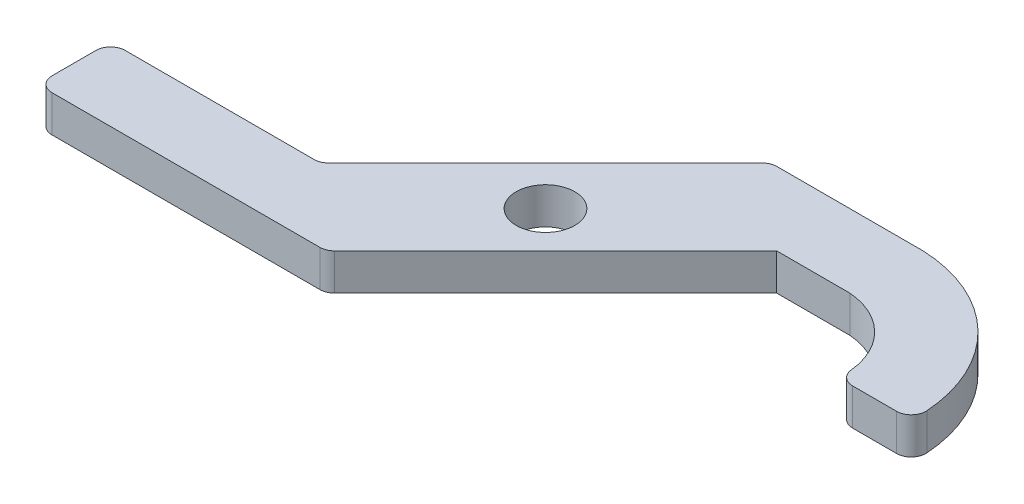
ISO-10303-21;
HEADER;
FILE_DESCRIPTION(('STEP AP214'),'2;1');
FILE_NAME('part.step','',(''),(''),'','','');
FILE_SCHEMA(('AUTOMOTIVE_DESIGN { 1 0 10303 214 1 1 1 1 }'));
ENDSEC;
DATA;
#1=APPLICATION_CONTEXT('core data for automotive mechanical design processes');
#2=APPLICATION_PROTOCOL_DEFINITION('international standard','automotive_design',2000,#1);
#3=PRODUCT_CONTEXT('',#1,'mechanical');
#4=PRODUCT('Part','Part','',(#3));
#5=PRODUCT_RELATED_PRODUCT_CATEGORY('part','',(#4));
#6=PRODUCT_DEFINITION_FORMATION('','',#4);
#7=PRODUCT_DEFINITION_CONTEXT('part definition',#1,'design');
#8=PRODUCT_DEFINITION('design','',#6,#7);
#9=PRODUCT_DEFINITION_SHAPE('','',#8);
#10=(LENGTH_UNIT() NAMED_UNIT(*) SI_UNIT(.MILLI.,.METRE.));
#11=(NAMED_UNIT(*) PLANE_ANGLE_UNIT() SI_UNIT($,.RADIAN.));
#12=(NAMED_UNIT(*) SI_UNIT($,.STERADIAN.) SOLID_ANGLE_UNIT());
#13=UNCERTAINTY_MEASURE_WITH_UNIT(LENGTH_MEASURE(1.E-05),#10,'distance_accuracy_value','');
#14=(GEOMETRIC_REPRESENTATION_CONTEXT(3) GLOBAL_UNCERTAINTY_ASSIGNED_CONTEXT((#13)) GLOBAL_UNIT_ASSIGNED_CONTEXT((#10,
#11,#12)) REPRESENTATION_CONTEXT('',''));
#15=CARTESIAN_POINT('',(0.,0.,0.));
#16=DIRECTION('',(0.,0.,1.));
#17=DIRECTION('',(1.,0.,0.));
#18=AXIS2_PLACEMENT_3D('',#15,#16,#17);
#19=CARTESIAN_POINT('',(-27.4559916240375,6.35,-14.569992415447));
#20=DIRECTION('',(0.,-1.,0.));
#21=DIRECTION('',(0.,0.,-1.));
#22=AXIS2_PLACEMENT_3D('',#19,#20,#21);
#23=PLANE('',#22);
#24=CARTESIAN_POINT('',(-27.4559916240375,6.35,-14.569992415447));
#25=DIRECTION('',(0.,-1.,0.));
#26=DIRECTION('',(0.,0.,-1.));
#27=AXIS2_PLACEMENT_3D('',#24,#25,#26);
#28=CIRCLE('',#27,2.54);
#29=CARTESIAN_POINT('',(-25.6599403998237,6.35,-12.7739411912331));
#30=VERTEX_POINT('',#29);
#31=CARTESIAN_POINT('',(-27.4559916240375,6.35,-12.029992415447));
#32=VERTEX_POINT('',#31);
#33=EDGE_CURVE('E316',#30,#32,#28,.T.);
#34=ORIENTED_EDGE('',*,*,#33,.T.);
#35=DIRECTION('',(-1.,0.,0.));
#36=VECTOR('',#35,1.);
#37=CARTESIAN_POINT('',(-27.4559916240375,6.35,-12.029992415447));
#38=LINE('',#37,#36);
#39=CARTESIAN_POINT('',(-60.2306041945383,6.35,-12.029992415447));
#40=VERTEX_POINT('',#39);
#41=EDGE_CURVE('E182',#32,#40,#38,.T.);
#42=ORIENTED_EDGE('',*,*,#41,.T.);
#43=CARTESIAN_POINT('',(-60.2306041945383,6.35,-9.48999241544698));
#44=DIRECTION('',(0.,1.,0.));
#45=DIRECTION('',(0.,0.,1.));
#46=AXIS2_PLACEMENT_3D('',#43,#44,#45);
#47=CIRCLE('',#46,2.54);
#48=CARTESIAN_POINT('',(-62.7706041945383,6.35,-9.48999241544698));
#49=VERTEX_POINT('',#48);
#50=EDGE_CURVE('E365',#40,#49,#47,.T.);
#51=ORIENTED_EDGE('',*,*,#50,.T.);
#52=DIRECTION('',(0.,0.,-1.));
#53=VECTOR('',#52,1.);
#54=CARTESIAN_POINT('',(-62.7706041945383,6.35,-1.86999241544697));
#55=LINE('',#54,#53);
#56=CARTESIAN_POINT('',(-62.7706041945383,6.35,-1.86999241544697));
#57=VERTEX_POINT('',#56);
#58=EDGE_CURVE('E375',#57,#49,#55,.T.);
#59=ORIENTED_EDGE('',*,*,#58,.F.);
#60=CARTESIAN_POINT('',(-60.2306041945383,6.35,-1.86999241544697));
#61=DIRECTION('',(0.,-1.,0.));
#62=DIRECTION('',(0.,0.,-1.));
#63=AXIS2_PLACEMENT_3D('',#60,#61,#62);
#64=CIRCLE('',#63,2.54);
#65=CARTESIAN_POINT('',(-60.2306041945383,6.35,0.670007584553028));
#66=VERTEX_POINT('',#65);
#67=EDGE_CURVE('E379',#66,#57,#64,.T.);
#68=ORIENTED_EDGE('',*,*,#67,.F.);
#69=DIRECTION('',(-1.,0.,0.));
#70=VECTOR('',#69,1.);
#71=CARTESIAN_POINT('',(-13.7521024484274,6.35,0.670007584553022));
#72=LINE('',#71,#70);
#73=CARTESIAN_POINT('',(-13.7521024484274,6.35,0.670007584553021));
#74=VERTEX_POINT('',#73);
#75=EDGE_CURVE('E383',#74,#66,#72,.T.);
#76=ORIENTED_EDGE('',*,*,#75,.F.);
#77=CARTESIAN_POINT('',(-13.7521024484274,6.35,-1.86999241544698));
#78=DIRECTION('',(0.,-1.,0.));
#79=DIRECTION('',(0.,0.,-1.));
#80=AXIS2_PLACEMENT_3D('',#77,#78,#79);
#81=CIRCLE('',#80,2.54);
#82=CARTESIAN_POINT('',(-11.9560512242136,6.35,-0.0739411912331479));
#83=VERTEX_POINT('',#82);
#84=EDGE_CURVE('E391',#83,#74,#81,.T.);
#85=ORIENTED_EDGE('',*,*,#84,.F.);
#86=DIRECTION('',(0.707106781186548,0.,-0.707106781186548));
#87=VECTOR('',#86,1.);
#88=CARTESIAN_POINT('',(-11.9560512242136,6.35,-0.0739411912331479));
#89=LINE('',#88,#87);
#90=CARTESIAN_POINT('',(26.4038891756102,6.35,-38.4338815910569));
#91=VERTEX_POINT('',#90);
#92=EDGE_CURVE('E395',#83,#91,#89,.T.);
#93=ORIENTED_EDGE('',*,*,#92,.T.);
#94=DIRECTION('',(1.,0.,0.));
#95=VECTOR('',#94,1.);
#96=CARTESIAN_POINT('',(26.4038891756102,6.35,-38.4338815910569));
#97=LINE('',#96,#95);
#98=CARTESIAN_POINT('',(39.1038891756094,6.35,-38.4338815910569));
#99=VERTEX_POINT('',#98);
#100=EDGE_CURVE('E398',#91,#99,#97,.T.);
#101=ORIENTED_EDGE('',*,*,#100,.T.);
#102=CARTESIAN_POINT('',(38.1,6.35,-25.7338815910569));
#103=DIRECTION('',(0.,-1.,0.));
#104=DIRECTION('',(0.,0.,-1.));
#105=AXIS2_PLACEMENT_3D('',#102,#103,#104);
#106=CIRCLE('',#105,12.7396151227934);
#107=CARTESIAN_POINT('',(50.7750722767063,6.35,-27.0146377181857));
#108=VERTEX_POINT('',#107);
#109=EDGE_CURVE('E401',#99,#108,#106,.T.);
#110=ORIENTED_EDGE('',*,*,#109,.T.);
#111=CARTESIAN_POINT('',(53.3022038479915,6.35,-27.269992415447));
#112=DIRECTION('',(0.,-1.,0.));
#113=DIRECTION('',(0.,0.,-1.));
#114=AXIS2_PLACEMENT_3D('',#111,#112,#113);
#115=CIRCLE('',#114,2.54);
#116=CARTESIAN_POINT('',(53.3022038479915,6.35,-24.729992415447));
#117=VERTEX_POINT('',#116);
#118=EDGE_CURVE('E404',#117,#108,#115,.T.);
#119=ORIENTED_EDGE('',*,*,#118,.F.);
#120=DIRECTION('',(1.,0.,0.));
#121=VECTOR('',#120,1.);
#122=CARTESIAN_POINT('',(53.3022038479915,6.35,-24.729992415447));
#123=LINE('',#122,#121);
#124=CARTESIAN_POINT('',(60.9282066091519,6.35,-24.729992415447));
#125=VERTEX_POINT('',#124);
#126=EDGE_CURVE('E408',#117,#125,#123,.T.);
#127=ORIENTED_EDGE('',*,*,#126,.T.);
#128=CARTESIAN_POINT('',(60.9282066091519,6.35,-27.269992415447));
#129=DIRECTION('',(0.,1.,0.));
#130=DIRECTION('',(0.,0.,1.));
#131=AXIS2_PLACEMENT_3D('',#128,#129,#130);
#132=CIRCLE('',#131,2.54);
#133=CARTESIAN_POINT('',(63.4624755692073,6.35,-27.4405234627653));
#134=VERTEX_POINT('',#133);
#135=EDGE_CURVE('E411',#125,#134,#132,.T.);
#136=ORIENTED_EDGE('',*,*,#135,.T.);
#137=CARTESIAN_POINT('',(38.0999999999999,6.35,-25.7338815910569));
#138=DIRECTION('',(0.,-1.,0.));
#139=DIRECTION('',(0.,0.,-1.));
#140=AXIS2_PLACEMENT_3D('',#137,#138,#139);
#141=CIRCLE('',#140,25.4198307129869);
#142=CARTESIAN_POINT('',(39.1038891756115,6.35,-51.1338815910569));
#143=VERTEX_POINT('',#142);
#144=EDGE_CURVE('E244',#143,#134,#141,.T.);
#145=ORIENTED_EDGE('',*,*,#144,.F.);
#146=DIRECTION('',(1.,0.,0.));
#147=VECTOR('',#146,1.);
#148=CARTESIAN_POINT('',(13.7521024484277,6.35,-51.1338815910569));
#149=LINE('',#148,#147);
#150=CARTESIAN_POINT('',(13.7521024484277,6.35,-51.1338815910569));
#151=VERTEX_POINT('',#150);
#152=EDGE_CURVE('E228',#151,#143,#149,.T.);
#153=ORIENTED_EDGE('',*,*,#152,.F.);
#154=CARTESIAN_POINT('',(13.7521024484277,6.35,-48.5938815910569));
#155=DIRECTION('',(0.,-1.,0.));
#156=DIRECTION('',(0.,0.,-1.));
#157=AXIS2_PLACEMENT_3D('',#154,#155,#156);
#158=CIRCLE('',#157,2.54);
#159=CARTESIAN_POINT('',(11.9560512242139,6.35,-50.3899328152707));
#160=VERTEX_POINT('',#159);
#161=EDGE_CURVE('E242',#160,#151,#158,.T.);
#162=ORIENTED_EDGE('',*,*,#161,.F.);
#163=DIRECTION('',(0.707106781186548,0.,-0.707106781186548));
#164=VECTOR('',#163,1.);
#165=CARTESIAN_POINT('',(-25.6599403998237,6.35,-12.7739411912331));
#166=LINE('',#165,#164);
#167=EDGE_CURVE('E249',#30,#160,#166,.T.);
#168=ORIENTED_EDGE('',*,*,#167,.F.);
#169=EDGE_LOOP('',(#34,#42,#51,#59,#68,#76,#85,#93,#101,#110,#119,#127,#136,#145,#153,#162,#168));
#170=FACE_BOUND('',#169,.T.);
#171=CARTESIAN_POINT('',(0.,6.35,-24.729992415447));
#172=DIRECTION('',(0.,1.,0.));
#173=DIRECTION('',(0.,0.,1.));
#174=AXIS2_PLACEMENT_3D('',#171,#172,#173);
#175=CIRCLE('',#174,5.08);
#176=CARTESIAN_POINT('',(0.,6.35,-19.649992415447));
#177=VERTEX_POINT('',#176);
#178=EDGE_CURVE('E259',#177,#177,#175,.T.);
#179=ORIENTED_EDGE('',*,*,#178,.F.);
#180=EDGE_LOOP('',(#179));
#181=FACE_BOUND('',#180,.T.);
#182=ADVANCED_FACE('F99',(#170,#181),#23,.F.);
#183=CARTESIAN_POINT('',(-27.4559916240375,0.,-14.569992415447));
#184=DIRECTION('',(0.,-1.,0.));
#185=DIRECTION('',(0.,0.,-1.));
#186=AXIS2_PLACEMENT_3D('',#183,#184,#185);
#187=PLANE('',#186);
#188=CARTESIAN_POINT('',(-27.4559916240375,0.,-14.569992415447));
#189=DIRECTION('',(0.,-1.,0.));
#190=DIRECTION('',(0.,0.,-1.));
#191=AXIS2_PLACEMENT_3D('',#188,#189,#190);
#192=CIRCLE('',#191,2.54);
#193=CARTESIAN_POINT('',(-25.6599403998237,0.,-12.7739411912331));
#194=VERTEX_POINT('',#193);
#195=CARTESIAN_POINT('',(-27.4559916240375,0.,-12.029992415447));
#196=VERTEX_POINT('',#195);
#197=EDGE_CURVE('E255',#194,#196,#192,.T.);
#198=ORIENTED_EDGE('',*,*,#197,.F.);
#199=DIRECTION('',(0.707106781186548,0.,-0.707106781186548));
#200=VECTOR('',#199,1.);
#201=CARTESIAN_POINT('',(-25.6599403998237,0.,-12.7739411912331));
#202=LINE('',#201,#200);
#203=CARTESIAN_POINT('',(11.9560512242139,0.,-50.3899328152707));
#204=VERTEX_POINT('',#203);
#205=EDGE_CURVE('E312',#194,#204,#202,.T.);
#206=ORIENTED_EDGE('',*,*,#205,.T.);
#207=CARTESIAN_POINT('',(13.7521024484277,0.,-48.5938815910569));
#208=DIRECTION('',(0.,-1.,0.));
#209=DIRECTION('',(0.,0.,-1.));
#210=AXIS2_PLACEMENT_3D('',#207,#208,#209);
#211=CIRCLE('',#210,2.54);
#212=CARTESIAN_POINT('',(13.7521024484277,0.,-51.1338815910569));
#213=VERTEX_POINT('',#212);
#214=EDGE_CURVE('E309',#204,#213,#211,.T.);
#215=ORIENTED_EDGE('',*,*,#214,.T.);
#216=DIRECTION('',(1.,0.,0.));
#217=VECTOR('',#216,1.);
#218=CARTESIAN_POINT('',(13.7521024484277,0.,-51.1338815910569));
#219=LINE('',#218,#217);
#220=CARTESIAN_POINT('',(39.1038891756115,0.,-51.1338815910569));
#221=VERTEX_POINT('',#220);
#222=EDGE_CURVE('E230',#213,#221,#219,.T.);
#223=ORIENTED_EDGE('',*,*,#222,.T.);
#224=CARTESIAN_POINT('',(38.0999999999999,0.,-25.7338815910569));
#225=DIRECTION('',(0.,-1.,0.));
#226=DIRECTION('',(0.,0.,-1.));
#227=AXIS2_PLACEMENT_3D('',#224,#225,#226);
#228=CIRCLE('',#227,25.4198307129869);
#229=CARTESIAN_POINT('',(63.4624755692073,0.,-27.4405234627653));
#230=VERTEX_POINT('',#229);
#231=EDGE_CURVE('E303',#221,#230,#228,.T.);
#232=ORIENTED_EDGE('',*,*,#231,.T.);
#233=CARTESIAN_POINT('',(60.9282066091519,0.,-27.269992415447));
#234=DIRECTION('',(0.,1.,0.));
#235=DIRECTION('',(0.,0.,1.));
#236=AXIS2_PLACEMENT_3D('',#233,#234,#235);
#237=CIRCLE('',#236,2.54);
#238=CARTESIAN_POINT('',(60.9282066091519,0.,-24.729992415447));
#239=VERTEX_POINT('',#238);
#240=EDGE_CURVE('E299',#239,#230,#237,.T.);
#241=ORIENTED_EDGE('',*,*,#240,.F.);
#242=DIRECTION('',(1.,0.,0.));
#243=VECTOR('',#242,1.);
#244=CARTESIAN_POINT('',(53.3022038479915,0.,-24.729992415447));
#245=LINE('',#244,#243);
#246=CARTESIAN_POINT('',(53.3022038479915,0.,-24.729992415447));
#247=VERTEX_POINT('',#246);
#248=EDGE_CURVE('E296',#247,#239,#245,.T.);
#249=ORIENTED_EDGE('',*,*,#248,.F.);
#250=CARTESIAN_POINT('',(53.3022038479915,0.,-27.269992415447));
#251=DIRECTION('',(0.,-1.,0.));
#252=DIRECTION('',(0.,0.,-1.));
#253=AXIS2_PLACEMENT_3D('',#250,#251,#252);
#254=CIRCLE('',#253,2.54);
#255=CARTESIAN_POINT('',(50.7750722767063,0.,-27.0146377181857));
#256=VERTEX_POINT('',#255);
#257=EDGE_CURVE('E292',#247,#256,#254,.T.);
#258=ORIENTED_EDGE('',*,*,#257,.T.);
#259=CARTESIAN_POINT('',(38.1,0.,-25.7338815910569));
#260=DIRECTION('',(0.,-1.,0.));
#261=DIRECTION('',(0.,0.,-1.));
#262=AXIS2_PLACEMENT_3D('',#259,#260,#261);
#263=CIRCLE('',#262,12.7396151227934);
#264=CARTESIAN_POINT('',(39.1038891756094,0.,-38.4338815910569));
#265=VERTEX_POINT('',#264);
#266=EDGE_CURVE('E288',#265,#256,#263,.T.);
#267=ORIENTED_EDGE('',*,*,#266,.F.);
#268=DIRECTION('',(1.,0.,0.));
#269=VECTOR('',#268,1.);
#270=CARTESIAN_POINT('',(26.4038891756102,0.,-38.4338815910569));
#271=LINE('',#270,#269);
#272=CARTESIAN_POINT('',(26.4038891756102,0.,-38.4338815910569));
#273=VERTEX_POINT('',#272);
#274=EDGE_CURVE('E285',#273,#265,#271,.T.);
#275=ORIENTED_EDGE('',*,*,#274,.F.);
#276=DIRECTION('',(0.707106781186548,0.,-0.707106781186548));
#277=VECTOR('',#276,1.);
#278=CARTESIAN_POINT('',(-11.9560512242136,0.,-0.0739411912331479));
#279=LINE('',#278,#277);
#280=CARTESIAN_POINT('',(-11.9560512242136,0.,-0.0739411912331479));
#281=VERTEX_POINT('',#280);
#282=EDGE_CURVE('E282',#281,#273,#279,.T.);
#283=ORIENTED_EDGE('',*,*,#282,.F.);
#284=CARTESIAN_POINT('',(-13.7521024484274,0.,-1.86999241544698));
#285=DIRECTION('',(0.,-1.,0.));
#286=DIRECTION('',(0.,0.,-1.));
#287=AXIS2_PLACEMENT_3D('',#284,#285,#286);
#288=CIRCLE('',#287,2.54);
#289=CARTESIAN_POINT('',(-13.7521024484274,0.,0.670007584553021));
#290=VERTEX_POINT('',#289);
#291=EDGE_CURVE('E278',#281,#290,#288,.T.);
#292=ORIENTED_EDGE('',*,*,#291,.T.);
#293=DIRECTION('',(-1.,0.,0.));
#294=VECTOR('',#293,1.);
#295=CARTESIAN_POINT('',(-13.7521024484274,0.,0.670007584553022));
#296=LINE('',#295,#294);
#297=CARTESIAN_POINT('',(-60.2306041945383,0.,0.670007584553028));
#298=VERTEX_POINT('',#297);
#299=EDGE_CURVE('E274',#290,#298,#296,.T.);
#300=ORIENTED_EDGE('',*,*,#299,.T.);
#301=CARTESIAN_POINT('',(-60.2306041945383,0.,-1.86999241544697));
#302=DIRECTION('',(0.,-1.,0.));
#303=DIRECTION('',(0.,0.,-1.));
#304=AXIS2_PLACEMENT_3D('',#301,#302,#303);
#305=CIRCLE('',#304,2.54);
#306=CARTESIAN_POINT('',(-62.7706041945383,0.,-1.86999241544697));
#307=VERTEX_POINT('',#306);
#308=EDGE_CURVE('E270',#298,#307,#305,.T.);
#309=ORIENTED_EDGE('',*,*,#308,.T.);
#310=DIRECTION('',(0.,0.,-1.));
#311=VECTOR('',#310,1.);
#312=CARTESIAN_POINT('',(-62.7706041945383,0.,-1.86999241544697));
#313=LINE('',#312,#311);
#314=CARTESIAN_POINT('',(-62.7706041945383,0.,-9.48999241544698));
#315=VERTEX_POINT('',#314);
#316=EDGE_CURVE('E266',#307,#315,#313,.T.);
#317=ORIENTED_EDGE('',*,*,#316,.T.);
#318=CARTESIAN_POINT('',(-60.2306041945383,0.,-9.48999241544698));
#319=DIRECTION('',(0.,1.,0.));
#320=DIRECTION('',(0.,0.,1.));
#321=AXIS2_PLACEMENT_3D('',#318,#319,#320);
#322=CIRCLE('',#321,2.54);
#323=CARTESIAN_POINT('',(-60.2306041945383,0.,-12.029992415447));
#324=VERTEX_POINT('',#323);
#325=EDGE_CURVE('E262',#324,#315,#322,.T.);
#326=ORIENTED_EDGE('',*,*,#325,.F.);
#327=DIRECTION('',(-1.,0.,0.));
#328=VECTOR('',#327,1.);
#329=CARTESIAN_POINT('',(-27.4559916240375,0.,-12.029992415447));
#330=LINE('',#329,#328);
#331=EDGE_CURVE('E258',#196,#324,#330,.T.);
#332=ORIENTED_EDGE('',*,*,#331,.F.);
#333=EDGE_LOOP('',(#198,#206,#215,#223,#232,#241,#249,#258,#267,#275,#283,#292,#300,#309,#317,
#326,#332));
#334=FACE_BOUND('',#333,.T.);
#335=CARTESIAN_POINT('',(0.,0.,-24.729992415447));
#336=DIRECTION('',(0.,1.,0.));
#337=DIRECTION('',(0.,0.,1.));
#338=AXIS2_PLACEMENT_3D('',#335,#336,#337);
#339=CIRCLE('',#338,5.08);
#340=CARTESIAN_POINT('',(0.,0.,-19.649992415447));
#341=VERTEX_POINT('',#340);
#342=EDGE_CURVE('E448',#341,#341,#339,.T.);
#343=ORIENTED_EDGE('',*,*,#342,.T.);
#344=EDGE_LOOP('',(#343));
#345=FACE_BOUND('',#344,.T.);
#346=ADVANCED_FACE('F367',(#334,#345),#187,.T.);
#347=CARTESIAN_POINT('',(-27.4559916240375,6.35,-14.569992415447));
#348=DIRECTION('',(0.,-1.,0.));
#349=DIRECTION('',(0.,0.,-1.));
#350=AXIS2_PLACEMENT_3D('',#347,#348,#349);
#351=CYLINDRICAL_SURFACE('',#350,2.54);
#352=ORIENTED_EDGE('',*,*,#197,.T.);
#353=DIRECTION('',(0.,-1.,0.));
#354=VECTOR('',#353,1.);
#355=CARTESIAN_POINT('',(-27.4559916240375,6.35,-12.029992415447));
#356=LINE('',#355,#354);
#357=EDGE_CURVE('E12',#32,#196,#356,.T.);
#358=ORIENTED_EDGE('',*,*,#357,.F.);
#359=ORIENTED_EDGE('',*,*,#33,.F.);
#360=DIRECTION('',(0.,-1.,0.));
#361=VECTOR('',#360,1.);
#362=CARTESIAN_POINT('',(-25.6599403998237,6.35,-12.7739411912331));
#363=LINE('',#362,#361);
#364=EDGE_CURVE('E117',#30,#194,#363,.T.);
#365=ORIENTED_EDGE('',*,*,#364,.T.);
#366=EDGE_LOOP('',(#352,#358,#359,#365));
#367=FACE_BOUND('',#366,.T.);
#368=ADVANCED_FACE('F101',(#367),#351,.F.);
#369=CARTESIAN_POINT('',(-27.4559916240375,6.35,-12.029992415447));
#370=DIRECTION('',(0.,0.,1.));
#371=DIRECTION('',(1.,0.,0.));
#372=AXIS2_PLACEMENT_3D('',#369,#370,#371);
#373=PLANE('',#372);
#374=ORIENTED_EDGE('',*,*,#331,.T.);
#375=DIRECTION('',(0.,-1.,0.));
#376=VECTOR('',#375,1.);
#377=CARTESIAN_POINT('',(-60.2306041945383,6.35,-12.029992415447));
#378=LINE('',#377,#376);
#379=EDGE_CURVE('E109',#40,#324,#378,.T.);
#380=ORIENTED_EDGE('',*,*,#379,.F.);
#381=ORIENTED_EDGE('',*,*,#41,.F.);
#382=ORIENTED_EDGE('',*,*,#357,.T.);
#383=EDGE_LOOP('',(#374,#380,#381,#382));
#384=FACE_BOUND('',#383,.T.);
#385=ADVANCED_FACE('F439',(#384),#373,.F.);
#386=CARTESIAN_POINT('',(-60.2306041945383,6.35,-9.48999241544698));
#387=DIRECTION('',(0.,-1.,0.));
#388=DIRECTION('',(0.,0.,-1.));
#389=AXIS2_PLACEMENT_3D('',#386,#387,#388);
#390=CYLINDRICAL_SURFACE('',#389,2.54);
#391=ORIENTED_EDGE('',*,*,#325,.T.);
#392=DIRECTION('',(0.,-1.,0.));
#393=VECTOR('',#392,1.);
#394=CARTESIAN_POINT('',(-62.7706041945383,6.35,-9.48999241544698));
#395=LINE('',#394,#393);
#396=EDGE_CURVE('E356',#49,#315,#395,.T.);
#397=ORIENTED_EDGE('',*,*,#396,.F.);
#398=ORIENTED_EDGE('',*,*,#50,.F.);
#399=ORIENTED_EDGE('',*,*,#379,.T.);
#400=EDGE_LOOP('',(#391,#397,#398,#399));
#401=FACE_BOUND('',#400,.T.);
#402=ADVANCED_FACE('F363',(#401),#390,.T.);
#403=CARTESIAN_POINT('',(-62.7706041945383,6.35,-1.86999241544697));
#404=DIRECTION('',(-1.,0.,0.));
#405=DIRECTION('',(0.,0.,1.));
#406=AXIS2_PLACEMENT_3D('',#403,#404,#405);
#407=PLANE('',#406);
#408=ORIENTED_EDGE('',*,*,#316,.F.);
#409=DIRECTION('',(0.,-1.,0.));
#410=VECTOR('',#409,1.);
#411=CARTESIAN_POINT('',(-62.7706041945383,6.35,-1.86999241544697));
#412=LINE('',#411,#410);
#413=EDGE_CURVE('E353',#57,#307,#412,.T.);
#414=ORIENTED_EDGE('',*,*,#413,.F.);
#415=ORIENTED_EDGE('',*,*,#58,.T.);
#416=ORIENTED_EDGE('',*,*,#396,.T.);
#417=EDGE_LOOP('',(#408,#414,#415,#416));
#418=FACE_BOUND('',#417,.T.);
#419=ADVANCED_FACE('F372',(#418),#407,.T.);
#420=CARTESIAN_POINT('',(-60.2306041945383,6.35,-1.86999241544697));
#421=DIRECTION('',(0.,-1.,0.));
#422=DIRECTION('',(0.,0.,-1.));
#423=AXIS2_PLACEMENT_3D('',#420,#421,#422);
#424=CYLINDRICAL_SURFACE('',#423,2.54);
#425=ORIENTED_EDGE('',*,*,#308,.F.);
#426=DIRECTION('',(0.,-1.,0.));
#427=VECTOR('',#426,1.);
#428=CARTESIAN_POINT('',(-60.2306041945383,6.35,0.670007584553028));
#429=LINE('',#428,#427);
#430=EDGE_CURVE('E350',#66,#298,#429,.T.);
#431=ORIENTED_EDGE('',*,*,#430,.F.);
#432=ORIENTED_EDGE('',*,*,#67,.T.);
#433=ORIENTED_EDGE('',*,*,#413,.T.);
#434=EDGE_LOOP('',(#425,#431,#432,#433));
#435=FACE_BOUND('',#434,.T.);
#436=ADVANCED_FACE('F464',(#435),#424,.T.);
#437=CARTESIAN_POINT('',(-13.7521024484274,6.35,0.670007584553022));
#438=DIRECTION('',(0.,0.,1.));
#439=DIRECTION('',(1.,0.,0.));
#440=AXIS2_PLACEMENT_3D('',#437,#438,#439);
#441=PLANE('',#440);
#442=ORIENTED_EDGE('',*,*,#299,.F.);
#443=DIRECTION('',(0.,-1.,0.));
#444=VECTOR('',#443,1.);
#445=CARTESIAN_POINT('',(-13.7521024484274,6.35,0.670007584553021));
#446=LINE('',#445,#444);
#447=EDGE_CURVE('E347',#74,#290,#446,.T.);
#448=ORIENTED_EDGE('',*,*,#447,.F.);
#449=ORIENTED_EDGE('',*,*,#75,.T.);
#450=ORIENTED_EDGE('',*,*,#430,.T.);
#451=EDGE_LOOP('',(#442,#448,#449,#450));
#452=FACE_BOUND('',#451,.T.);
#453=ADVANCED_FACE('F467',(#452),#441,.T.);
#454=CARTESIAN_POINT('',(-13.7521024484274,6.35,-1.86999241544698));
#455=DIRECTION('',(0.,-1.,0.));
#456=DIRECTION('',(0.,0.,-1.));
#457=AXIS2_PLACEMENT_3D('',#454,#455,#456);
#458=CYLINDRICAL_SURFACE('',#457,2.54);
#459=ORIENTED_EDGE('',*,*,#291,.F.);
#460=DIRECTION('',(0.,-1.,0.));
#461=VECTOR('',#460,1.);
#462=CARTESIAN_POINT('',(-11.9560512242136,6.35,-0.0739411912331479));
#463=LINE('',#462,#461);
#464=EDGE_CURVE('E344',#83,#281,#463,.T.);
#465=ORIENTED_EDGE('',*,*,#464,.F.);
#466=ORIENTED_EDGE('',*,*,#84,.T.);
#467=ORIENTED_EDGE('',*,*,#447,.T.);
#468=EDGE_LOOP('',(#459,#465,#466,#467));
#469=FACE_BOUND('',#468,.T.);
#470=ADVANCED_FACE('F471',(#469),#458,.T.);
#471=CARTESIAN_POINT('',(-11.9560512242136,6.35,-0.0739411912331479));
#472=DIRECTION('',(-0.707106781186548,0.,-0.707106781186548));
#473=DIRECTION('',(-0.707106781186548,0.,0.707106781186548));
#474=AXIS2_PLACEMENT_3D('',#471,#472,#473);
#475=PLANE('',#474);
#476=ORIENTED_EDGE('',*,*,#282,.T.);
#477=DIRECTION('',(0.,-1.,0.));
#478=VECTOR('',#477,1.);
#479=CARTESIAN_POINT('',(26.4038891756102,6.35,-38.4338815910569));
#480=LINE('',#479,#478);
#481=EDGE_CURVE('E340',#91,#273,#480,.T.);
#482=ORIENTED_EDGE('',*,*,#481,.F.);
#483=ORIENTED_EDGE('',*,*,#92,.F.);
#484=ORIENTED_EDGE('',*,*,#464,.T.);
#485=EDGE_LOOP('',(#476,#482,#483,#484));
#486=FACE_BOUND('',#485,.T.);
#487=ADVANCED_FACE('F475',(#486),#475,.F.);
#488=CARTESIAN_POINT('',(26.4038891756102,6.35,-38.4338815910569));
#489=DIRECTION('',(0.,0.,-1.));
#490=DIRECTION('',(-1.,0.,0.));
#491=AXIS2_PLACEMENT_3D('',#488,#489,#490);
#492=PLANE('',#491);
#493=ORIENTED_EDGE('',*,*,#274,.T.);
#494=DIRECTION('',(0.,-1.,0.));
#495=VECTOR('',#494,1.);
#496=CARTESIAN_POINT('',(39.1038891756094,6.35,-38.4338815910569));
#497=LINE('',#496,#495);
#498=EDGE_CURVE('E336',#99,#265,#497,.T.);
#499=ORIENTED_EDGE('',*,*,#498,.F.);
#500=ORIENTED_EDGE('',*,*,#100,.F.);
#501=ORIENTED_EDGE('',*,*,#481,.T.);
#502=EDGE_LOOP('',(#493,#499,#500,#501));
#503=FACE_BOUND('',#502,.T.);
#504=ADVANCED_FACE('F479',(#503),#492,.F.);
#505=CARTESIAN_POINT('',(38.1,6.35,-25.7338815910569));
#506=DIRECTION('',(0.,-1.,0.));
#507=DIRECTION('',(0.,0.,-1.));
#508=AXIS2_PLACEMENT_3D('',#505,#506,#507);
#509=CYLINDRICAL_SURFACE('',#508,12.7396151227934);
#510=ORIENTED_EDGE('',*,*,#266,.T.);
#511=DIRECTION('',(0.,-1.,0.));
#512=VECTOR('',#511,1.);
#513=CARTESIAN_POINT('',(50.7750722767063,6.35,-27.0146377181857));
#514=LINE('',#513,#512);
#515=EDGE_CURVE('E333',#108,#256,#514,.T.);
#516=ORIENTED_EDGE('',*,*,#515,.F.);
#517=ORIENTED_EDGE('',*,*,#109,.F.);
#518=ORIENTED_EDGE('',*,*,#498,.T.);
#519=EDGE_LOOP('',(#510,#516,#517,#518));
#520=FACE_BOUND('',#519,.T.);
#521=ADVANCED_FACE('F483',(#520),#509,.F.);
#522=CARTESIAN_POINT('',(53.3022038479915,6.35,-27.269992415447));
#523=DIRECTION('',(0.,-1.,0.));
#524=DIRECTION('',(0.,0.,-1.));
#525=AXIS2_PLACEMENT_3D('',#522,#523,#524);
#526=CYLINDRICAL_SURFACE('',#525,2.54);
#527=ORIENTED_EDGE('',*,*,#257,.F.);
#528=DIRECTION('',(0.,-1.,0.));
#529=VECTOR('',#528,1.);
#530=CARTESIAN_POINT('',(53.3022038479915,6.35,-24.729992415447));
#531=LINE('',#530,#529);
#532=EDGE_CURVE('E330',#117,#247,#531,.T.);
#533=ORIENTED_EDGE('',*,*,#532,.F.);
#534=ORIENTED_EDGE('',*,*,#118,.T.);
#535=ORIENTED_EDGE('',*,*,#515,.T.);
#536=EDGE_LOOP('',(#527,#533,#534,#535));
#537=FACE_BOUND('',#536,.T.);
#538=ADVANCED_FACE('F487',(#537),#526,.T.);
#539=CARTESIAN_POINT('',(53.3022038479915,6.35,-24.729992415447));
#540=DIRECTION('',(0.,0.,-1.));
#541=DIRECTION('',(-1.,0.,0.));
#542=AXIS2_PLACEMENT_3D('',#539,#540,#541);
#543=PLANE('',#542);
#544=ORIENTED_EDGE('',*,*,#248,.T.);
#545=DIRECTION('',(0.,-1.,0.));
#546=VECTOR('',#545,1.);
#547=CARTESIAN_POINT('',(60.9282066091519,6.35,-24.729992415447));
#548=LINE('',#547,#546);
#549=EDGE_CURVE('E326',#125,#239,#548,.T.);
#550=ORIENTED_EDGE('',*,*,#549,.F.);
#551=ORIENTED_EDGE('',*,*,#126,.F.);
#552=ORIENTED_EDGE('',*,*,#532,.T.);
#553=EDGE_LOOP('',(#544,#550,#551,#552));
#554=FACE_BOUND('',#553,.T.);
#555=ADVANCED_FACE('F491',(#554),#543,.F.);
#556=CARTESIAN_POINT('',(60.9282066091519,6.35,-27.269992415447));
#557=DIRECTION('',(0.,-1.,0.));
#558=DIRECTION('',(0.,0.,-1.));
#559=AXIS2_PLACEMENT_3D('',#556,#557,#558);
#560=CYLINDRICAL_SURFACE('',#559,2.54);
#561=ORIENTED_EDGE('',*,*,#240,.T.);
#562=DIRECTION('',(0.,-1.,0.));
#563=VECTOR('',#562,1.);
#564=CARTESIAN_POINT('',(63.4624755692073,6.35,-27.4405234627653));
#565=LINE('',#564,#563);
#566=EDGE_CURVE('E323',#134,#230,#565,.T.);
#567=ORIENTED_EDGE('',*,*,#566,.F.);
#568=ORIENTED_EDGE('',*,*,#135,.F.);
#569=ORIENTED_EDGE('',*,*,#549,.T.);
#570=EDGE_LOOP('',(#561,#567,#568,#569));
#571=FACE_BOUND('',#570,.T.);
#572=ADVANCED_FACE('F495',(#571),#560,.T.);
#573=CARTESIAN_POINT('',(38.0999999999999,6.35,-25.7338815910569));
#574=DIRECTION('',(0.,-1.,0.));
#575=DIRECTION('',(0.,0.,-1.));
#576=AXIS2_PLACEMENT_3D('',#573,#574,#575);
#577=CYLINDRICAL_SURFACE('',#576,25.4198307129869);
#578=ORIENTED_EDGE('',*,*,#231,.F.);
#579=DIRECTION('',(0.,-1.,0.));
#580=VECTOR('',#579,1.);
#581=CARTESIAN_POINT('',(39.1038891756115,6.35,-51.1338815910569));
#582=LINE('',#581,#580);
#583=EDGE_CURVE('E235',#143,#221,#582,.T.);
#584=ORIENTED_EDGE('',*,*,#583,.F.);
#585=ORIENTED_EDGE('',*,*,#144,.T.);
#586=ORIENTED_EDGE('',*,*,#566,.T.);
#587=EDGE_LOOP('',(#578,#584,#585,#586));
#588=FACE_BOUND('',#587,.T.);
#589=ADVANCED_FACE('F416',(#588),#577,.T.);
#590=CARTESIAN_POINT('',(13.7521024484277,6.35,-51.1338815910569));
#591=DIRECTION('',(0.,0.,-1.));
#592=DIRECTION('',(-1.,0.,0.));
#593=AXIS2_PLACEMENT_3D('',#590,#591,#592);
#594=PLANE('',#593);
#595=ORIENTED_EDGE('',*,*,#222,.F.);
#596=DIRECTION('',(0.,-1.,0.));
#597=VECTOR('',#596,1.);
#598=CARTESIAN_POINT('',(13.7521024484277,6.35,-51.1338815910569));
#599=LINE('',#598,#597);
#600=EDGE_CURVE('E225',#151,#213,#599,.T.);
#601=ORIENTED_EDGE('',*,*,#600,.F.);
#602=ORIENTED_EDGE('',*,*,#152,.T.);
#603=ORIENTED_EDGE('',*,*,#583,.T.);
#604=EDGE_LOOP('',(#595,#601,#602,#603));
#605=FACE_BOUND('',#604,.T.);
#606=ADVANCED_FACE('F227',(#605),#594,.T.);
#607=CARTESIAN_POINT('',(13.7521024484277,6.35,-48.5938815910569));
#608=DIRECTION('',(0.,-1.,0.));
#609=DIRECTION('',(0.,0.,-1.));
#610=AXIS2_PLACEMENT_3D('',#607,#608,#609);
#611=CYLINDRICAL_SURFACE('',#610,2.54);
#612=ORIENTED_EDGE('',*,*,#214,.F.);
#613=DIRECTION('',(0.,-1.,0.));
#614=VECTOR('',#613,1.);
#615=CARTESIAN_POINT('',(11.9560512242139,6.35,-50.3899328152707));
#616=LINE('',#615,#614);
#617=EDGE_CURVE('E170',#160,#204,#616,.T.);
#618=ORIENTED_EDGE('',*,*,#617,.F.);
#619=ORIENTED_EDGE('',*,*,#161,.T.);
#620=ORIENTED_EDGE('',*,*,#600,.T.);
#621=EDGE_LOOP('',(#612,#618,#619,#620));
#622=FACE_BOUND('',#621,.T.);
#623=ADVANCED_FACE('F247',(#622),#611,.T.);
#624=CARTESIAN_POINT('',(-25.6599403998237,6.35,-12.7739411912331));
#625=DIRECTION('',(-0.707106781186548,0.,-0.707106781186548));
#626=DIRECTION('',(-0.707106781186548,0.,0.707106781186548));
#627=AXIS2_PLACEMENT_3D('',#624,#625,#626);
#628=PLANE('',#627);
#629=ORIENTED_EDGE('',*,*,#205,.F.);
#630=ORIENTED_EDGE('',*,*,#364,.F.);
#631=ORIENTED_EDGE('',*,*,#167,.T.);
#632=ORIENTED_EDGE('',*,*,#617,.T.);
#633=EDGE_LOOP('',(#629,#630,#631,#632));
#634=FACE_BOUND('',#633,.T.);
#635=ADVANCED_FACE('F419',(#634),#628,.T.);
#636=CARTESIAN_POINT('',(0.,6.35,-24.729992415447));
#637=DIRECTION('',(0.,-1.,0.));
#638=DIRECTION('',(0.,0.,-1.));
#639=AXIS2_PLACEMENT_3D('',#636,#637,#638);
#640=CYLINDRICAL_SURFACE('',#639,5.08);
#641=ORIENTED_EDGE('',*,*,#178,.T.);
#642=EDGE_LOOP('',(#641));
#643=FACE_BOUND('',#642,.T.);
#644=ORIENTED_EDGE('',*,*,#342,.F.);
#645=EDGE_LOOP('',(#644));
#646=FACE_BOUND('',#645,.T.);
#647=ADVANCED_FACE('F421',(#643,#646),#640,.F.);
#648=CLOSED_SHELL('',(#182,#346,#368,#385,#402,#419,#436,#453,#470,#487,#504,#521,#538,#555,
#572,#589,#606,#623,#635,#647));
#649=MANIFOLD_SOLID_BREP('B2',#648);
#650=ADVANCED_BREP_SHAPE_REPRESENTATION('',(#18,#649),#14);
#651=SHAPE_DEFINITION_REPRESENTATION(#9,#650);
ENDSEC;
END-ISO-10303-21;
